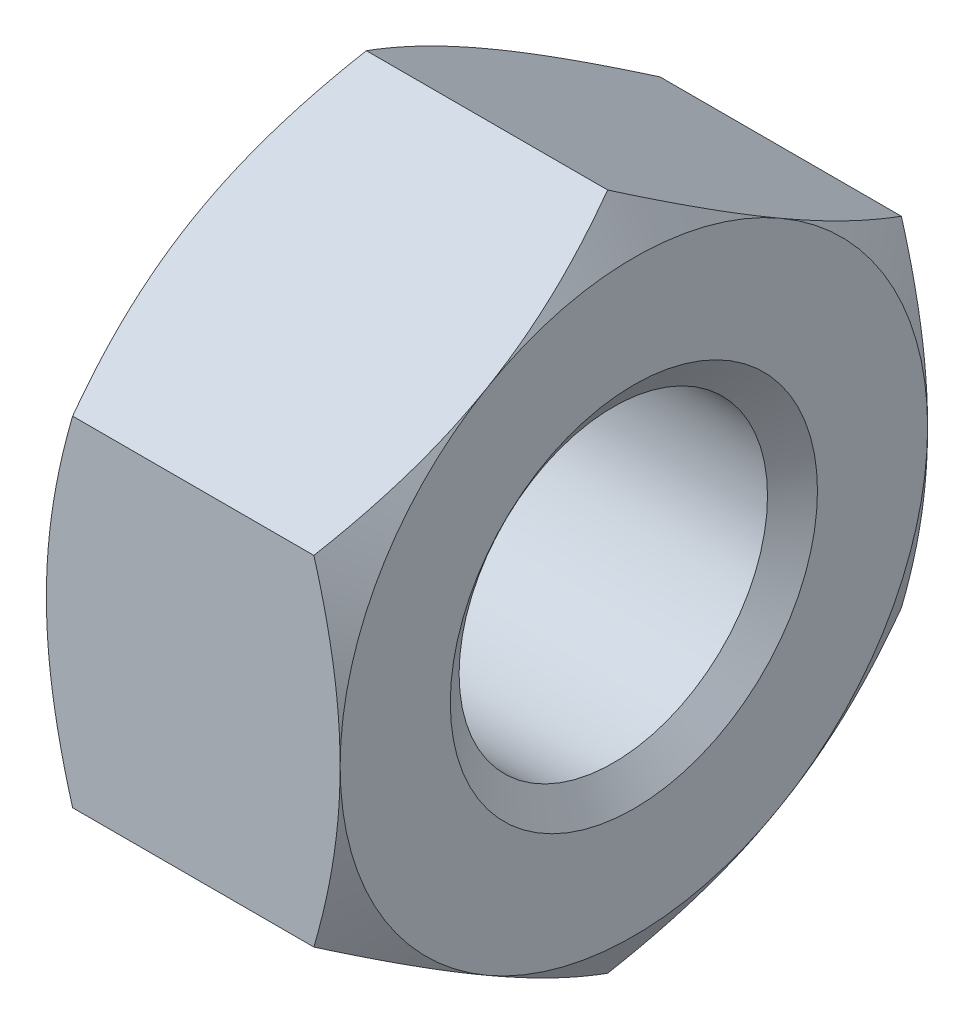
ISO-10303-21;
HEADER;
FILE_DESCRIPTION(('STEP AP214'),'2;1');
FILE_NAME('part.step','',(''),(''),'','','');
FILE_SCHEMA(('AUTOMOTIVE_DESIGN { 1 0 10303 214 1 1 1 1 }'));
ENDSEC;
DATA;
#1=APPLICATION_CONTEXT('core data for automotive mechanical design processes');
#2=APPLICATION_PROTOCOL_DEFINITION('international standard','automotive_design',2000,#1);
#3=PRODUCT_CONTEXT('',#1,'mechanical');
#4=PRODUCT('Part','Part','',(#3));
#5=PRODUCT_RELATED_PRODUCT_CATEGORY('part','',(#4));
#6=PRODUCT_DEFINITION_FORMATION('','',#4);
#7=PRODUCT_DEFINITION_CONTEXT('part definition',#1,'design');
#8=PRODUCT_DEFINITION('design','',#6,#7);
#9=PRODUCT_DEFINITION_SHAPE('','',#8);
#10=(LENGTH_UNIT() NAMED_UNIT(*) SI_UNIT(.MILLI.,.METRE.));
#11=(NAMED_UNIT(*) PLANE_ANGLE_UNIT() SI_UNIT($,.RADIAN.));
#12=(NAMED_UNIT(*) SI_UNIT($,.STERADIAN.) SOLID_ANGLE_UNIT());
#13=UNCERTAINTY_MEASURE_WITH_UNIT(LENGTH_MEASURE(1.E-05),#10,'distance_accuracy_value','');
#14=(GEOMETRIC_REPRESENTATION_CONTEXT(3) GLOBAL_UNCERTAINTY_ASSIGNED_CONTEXT((#13)) GLOBAL_UNIT_ASSIGNED_CONTEXT((#10,
#11,#12)) REPRESENTATION_CONTEXT('',''));
#15=CARTESIAN_POINT('',(0.,0.,0.));
#16=DIRECTION('',(0.,0.,1.));
#17=DIRECTION('',(1.,0.,0.));
#18=AXIS2_PLACEMENT_3D('',#15,#16,#17);
#19=CARTESIAN_POINT('',(-26.,14.9999999999999,0.));
#20=DIRECTION('',(1.,0.,0.));
#21=DIRECTION('',(0.,0.,-1.));
#22=AXIS2_PLACEMENT_3D('',#19,#20,#21);
#23=CYLINDRICAL_SURFACE('',#22,2.1);
#24=CARTESIAN_POINT('',(-22.2800830152839,14.9999999999999,0.));
#25=DIRECTION('',(1.,0.,0.));
#26=DIRECTION('',(0.,0.,-1.));
#27=AXIS2_PLACEMENT_3D('',#24,#25,#26);
#28=CIRCLE('',#27,2.1);
#29=CARTESIAN_POINT('',(-22.2800830152839,14.9999999999999,-2.1));
#30=VERTEX_POINT('',#29);
#31=EDGE_CURVE('E157',#30,#30,#28,.F.);
#32=ORIENTED_EDGE('',*,*,#31,.F.);
#33=EDGE_LOOP('',(#32));
#34=FACE_BOUND('',#33,.T.);
#35=CARTESIAN_POINT('',(-25.6945169847161,14.9999999999999,0.));
#36=DIRECTION('',(-1.,0.,0.));
#37=DIRECTION('',(0.,0.,1.));
#38=AXIS2_PLACEMENT_3D('',#35,#36,#37);
#39=CIRCLE('',#38,2.1);
#40=CARTESIAN_POINT('',(-25.6945169847161,14.9999999999999,2.1));
#41=VERTEX_POINT('',#40);
#42=EDGE_CURVE('E21',#41,#41,#39,.F.);
#43=ORIENTED_EDGE('',*,*,#42,.F.);
#44=EDGE_LOOP('',(#43));
#45=FACE_BOUND('',#44,.T.);
#46=ADVANCED_FACE('F16',(#34,#45),#23,.F.);
#47=CARTESIAN_POINT('',(-26.,14.9999999999999,7.99999999999999));
#48=DIRECTION('',(1.,0.,0.));
#49=DIRECTION('',(0.,0.,-1.));
#50=AXIS2_PLACEMENT_3D('',#47,#48,#49);
#51=PLANE('',#50);
#52=CARTESIAN_POINT('',(-26.,14.9999999999999,0.));
#53=DIRECTION('',(1.,0.,0.));
#54=DIRECTION('',(0.,0.,-1.));
#55=AXIS2_PLACEMENT_3D('',#52,#53,#54);
#56=CIRCLE('',#55,4.);
#57=CARTESIAN_POINT('',(-26.,14.9999999999999,-4.));
#58=VERTEX_POINT('',#57);
#59=CARTESIAN_POINT('',(-26.,18.4641016151377,-2.));
#60=VERTEX_POINT('',#59);
#61=EDGE_CURVE('E227',#58,#60,#56,.T.);
#62=ORIENTED_EDGE('',*,*,#61,.F.);
#63=CARTESIAN_POINT('',(-26.,14.9999999999999,0.));
#64=DIRECTION('',(1.,0.,0.));
#65=DIRECTION('',(0.,0.,-1.));
#66=AXIS2_PLACEMENT_3D('',#63,#64,#65);
#67=CIRCLE('',#66,4.);
#68=CARTESIAN_POINT('',(-26.,11.5358983848622,-2.));
#69=VERTEX_POINT('',#68);
#70=EDGE_CURVE('E151',#58,#69,#67,.F.);
#71=ORIENTED_EDGE('',*,*,#70,.T.);
#72=CARTESIAN_POINT('',(-26.,11.5358983848622,2.));
#73=VERTEX_POINT('',#72);
#74=EDGE_CURVE('E153',#69,#73,#67,.F.);
#75=ORIENTED_EDGE('',*,*,#74,.T.);
#76=CARTESIAN_POINT('',(-26.,14.9999999999999,4.));
#77=VERTEX_POINT('',#76);
#78=EDGE_CURVE('E385',#73,#77,#67,.F.);
#79=ORIENTED_EDGE('',*,*,#78,.T.);
#80=CARTESIAN_POINT('',(-26.,18.4641016151377,2.));
#81=VERTEX_POINT('',#80);
#82=EDGE_CURVE('E387',#77,#81,#67,.F.);
#83=ORIENTED_EDGE('',*,*,#82,.T.);
#84=EDGE_CURVE('E135',#81,#60,#67,.F.);
#85=ORIENTED_EDGE('',*,*,#84,.T.);
#86=EDGE_LOOP('',(#62,#71,#75,#79,#83,#85));
#87=FACE_BOUND('',#86,.T.);
#88=CARTESIAN_POINT('',(-26.,14.9999999999999,0.));
#89=DIRECTION('',(1.,0.,0.));
#90=DIRECTION('',(0.,0.,-1.));
#91=AXIS2_PLACEMENT_3D('',#88,#89,#90);
#92=CIRCLE('',#91,2.5);
#93=CARTESIAN_POINT('',(-26.,14.9999999999999,-2.5));
#94=VERTEX_POINT('',#93);
#95=EDGE_CURVE('E160',#94,#94,#92,.F.);
#96=ORIENTED_EDGE('',*,*,#95,.F.);
#97=EDGE_LOOP('',(#96));
#98=FACE_BOUND('',#97,.T.);
#99=ADVANCED_FACE('F280',(#87,#98),#51,.F.);
#100=CARTESIAN_POINT('',(-22.,14.9999999999999,7.99999999999999));
#101=DIRECTION('',(1.,0.,0.));
#102=DIRECTION('',(0.,0.,-1.));
#103=AXIS2_PLACEMENT_3D('',#100,#101,#102);
#104=PLANE('',#103);
#105=CARTESIAN_POINT('',(-22.,14.9999999999999,0.));
#106=DIRECTION('',(1.,0.,0.));
#107=DIRECTION('',(0.,0.,-1.));
#108=AXIS2_PLACEMENT_3D('',#105,#106,#107);
#109=CIRCLE('',#108,4.);
#110=CARTESIAN_POINT('',(-22.,11.5358983848622,-2.));
#111=VERTEX_POINT('',#110);
#112=CARTESIAN_POINT('',(-22.,14.9999999999999,-4.));
#113=VERTEX_POINT('',#112);
#114=EDGE_CURVE('E28',#111,#113,#109,.T.);
#115=ORIENTED_EDGE('',*,*,#114,.T.);
#116=CARTESIAN_POINT('',(-22.,14.9999999999999,0.));
#117=DIRECTION('',(1.,0.,0.));
#118=DIRECTION('',(0.,0.,-1.));
#119=AXIS2_PLACEMENT_3D('',#116,#117,#118);
#120=CIRCLE('',#119,4.);
#121=CARTESIAN_POINT('',(-22.,18.4641016151377,-2.));
#122=VERTEX_POINT('',#121);
#123=EDGE_CURVE('E35',#113,#122,#120,.T.);
#124=ORIENTED_EDGE('',*,*,#123,.T.);
#125=CARTESIAN_POINT('',(-22.,18.4641016151377,2.));
#126=VERTEX_POINT('',#125);
#127=EDGE_CURVE('E11',#122,#126,#109,.T.);
#128=ORIENTED_EDGE('',*,*,#127,.T.);
#129=CARTESIAN_POINT('',(-22.,14.9999999999999,4.));
#130=VERTEX_POINT('',#129);
#131=EDGE_CURVE('E26',#126,#130,#109,.T.);
#132=ORIENTED_EDGE('',*,*,#131,.T.);
#133=CARTESIAN_POINT('',(-22.,11.5358983848622,2.));
#134=VERTEX_POINT('',#133);
#135=EDGE_CURVE('E331',#130,#134,#109,.T.);
#136=ORIENTED_EDGE('',*,*,#135,.T.);
#137=EDGE_CURVE('E156',#134,#111,#109,.T.);
#138=ORIENTED_EDGE('',*,*,#137,.T.);
#139=EDGE_LOOP('',(#115,#124,#128,#132,#136,#138));
#140=FACE_BOUND('',#139,.T.);
#141=CARTESIAN_POINT('',(-22.,14.9999999999999,0.));
#142=DIRECTION('',(1.,0.,0.));
#143=DIRECTION('',(0.,0.,-1.));
#144=AXIS2_PLACEMENT_3D('',#141,#142,#143);
#145=CIRCLE('',#144,2.5);
#146=CARTESIAN_POINT('',(-22.,14.9999999999999,-2.5));
#147=VERTEX_POINT('',#146);
#148=EDGE_CURVE('E159',#147,#147,#145,.T.);
#149=ORIENTED_EDGE('',*,*,#148,.F.);
#150=EDGE_LOOP('',(#149));
#151=FACE_BOUND('',#150,.T.);
#152=ADVANCED_FACE('F232',(#140,#151),#104,.T.);
#153=CARTESIAN_POINT('',(-26.,19.6188021535169,0.));
#154=DIRECTION('',(0.,0.866025403784438,0.500000000000001));
#155=DIRECTION('',(0.,-0.500000000000001,0.866025403784438));
#156=AXIS2_PLACEMENT_3D('',#153,#154,#155);
#157=PLANE('',#156);
#158=DIRECTION('',(1.,0.,0.));
#159=VECTOR('',#158,1.);
#160=CARTESIAN_POINT('',(-26.,17.3094010767584,4.));
#161=LINE('',#160,#159);
#162=CARTESIAN_POINT('',(-25.6427344100918,17.3094010767584,4.));
#163=VERTEX_POINT('',#162);
#164=CARTESIAN_POINT('',(-22.3572655899082,17.3094010767584,4.));
#165=VERTEX_POINT('',#164);
#166=EDGE_CURVE('E147',#163,#165,#161,.T.);
#167=ORIENTED_EDGE('',*,*,#166,.T.);
#168=CARTESIAN_POINT('',(-22.3573322590748,17.3092856067046,4.0002));
#169=CARTESIAN_POINT('',(-22.2987178736483,17.4107717464616,3.82442084967677));
#170=CARTESIAN_POINT('',(-22.2454103214623,17.5131339088349,3.64712438367362));
#171=CARTESIAN_POINT('',(-22.1523616707464,17.719630724798,3.28946140682429));
#172=CARTESIAN_POINT('',(-22.1126534890297,17.823769047419,3.10908854102985));
#173=CARTESIAN_POINT('',(-22.0508422152803,18.0307551001179,2.75057818129721));
#174=CARTESIAN_POINT('',(-22.0283277315229,18.1335709837248,2.57249584706486));
#175=CARTESIAN_POINT('',(-22.0014506231466,18.3396865102852,2.21549328283349));
#176=CARTESIAN_POINT('',(-21.9970657414269,18.4429854041143,2.0365743503559));
#177=CARTESIAN_POINT('',(-22.00619007294,18.6360035252293,1.70225715780327));
#178=CARTESIAN_POINT('',(-22.017458953988,18.7257516533506,1.54680884001293));
#179=CARTESIAN_POINT('',(-22.0531739907982,18.9046632039205,1.23692494436494));
#180=CARTESIAN_POINT('',(-22.0776323457115,18.9938260075947,1.08249043825587));
#181=CARTESIAN_POINT('',(-22.1387760649193,19.1731064101519,0.771967672225419));
#182=CARTESIAN_POINT('',(-22.1757206036549,19.2632013193812,0.615918711936896));
#183=CARTESIAN_POINT('',(-22.259570072548,19.4420474282754,0.30614816459616));
#184=CARTESIAN_POINT('',(-22.3064553022127,19.5308009190496,0.152422609226222));
#185=CARTESIAN_POINT('',(-22.3573322590748,19.6189176235708,-0.00019999999999901));
#186=B_SPLINE_CURVE_WITH_KNOTS('',3,(#168,#169,#170,#171,#172,#173,#174,#175,#176,#177,#178,
#179,#180,#181,#182,#183,#184,#185),.UNSPECIFIED.,.F.,.F.,(4,2,2,2,2,2,2,2,4),(0.,
0.634047835695968,1.26961969224544,1.88946157213122,2.50854226669297,3.04757825393386,
3.58711366126904,4.13861653143764,4.68903648037743),.UNSPECIFIED.);
#187=EDGE_CURVE('E43',#165,#126,#186,.T.);
#188=ORIENTED_EDGE('',*,*,#187,.T.);
#189=CARTESIAN_POINT('',(-22.3572655899082,19.6188021535169,0.));
#190=VERTEX_POINT('',#189);
#191=EDGE_CURVE('E221',#126,#190,#186,.T.);
#192=ORIENTED_EDGE('',*,*,#191,.T.);
#193=DIRECTION('',(1.,0.,0.));
#194=VECTOR('',#193,1.);
#195=CARTESIAN_POINT('',(-26.,19.6188021535169,0.));
#196=LINE('',#195,#194);
#197=CARTESIAN_POINT('',(-25.6427344100918,19.6188021535169,0.));
#198=VERTEX_POINT('',#197);
#199=EDGE_CURVE('E132',#198,#190,#196,.T.);
#200=ORIENTED_EDGE('',*,*,#199,.F.);
#201=CARTESIAN_POINT('',(-25.6426677409252,17.3092856067046,4.0002));
#202=CARTESIAN_POINT('',(-25.7012821263517,17.4107717464616,3.82442084967677));
#203=CARTESIAN_POINT('',(-25.7545896785377,17.5131339088349,3.64712438367362));
#204=CARTESIAN_POINT('',(-25.8476383292536,17.719630724798,3.28946140682429));
#205=CARTESIAN_POINT('',(-25.8873465109703,17.823769047419,3.10908854102985));
#206=CARTESIAN_POINT('',(-25.9491577847197,18.0307551001179,2.75057818129721));
#207=CARTESIAN_POINT('',(-25.9716722684771,18.1335709837248,2.57249584706486));
#208=CARTESIAN_POINT('',(-25.9985493768534,18.3396865102852,2.21549328283349));
#209=CARTESIAN_POINT('',(-26.002934258573,18.4429854041143,2.0365743503559));
#210=CARTESIAN_POINT('',(-25.99380992706,18.6360035252293,1.70225715780327));
#211=CARTESIAN_POINT('',(-25.982541046012,18.7257516533506,1.54680884001293));
#212=CARTESIAN_POINT('',(-25.9468260092018,18.9046632039205,1.23692494436494));
#213=CARTESIAN_POINT('',(-25.9223676542885,18.9938260075947,1.08249043825587));
#214=CARTESIAN_POINT('',(-25.8612239350807,19.1731064101519,0.77196767222542));
#215=CARTESIAN_POINT('',(-25.8242793963451,19.2632013193812,0.615918711936897));
#216=CARTESIAN_POINT('',(-25.740429927452,19.4420474282754,0.306148164596161));
#217=CARTESIAN_POINT('',(-25.6935446977872,19.5308009190496,0.152422609226221));
#218=CARTESIAN_POINT('',(-25.6426677409252,19.6189176235708,-0.000199999999999123));
#219=B_SPLINE_CURVE_WITH_KNOTS('',3,(#201,#202,#203,#204,#205,#206,#207,#208,#209,#210,#211,
#212,#213,#214,#215,#216,#217,#218),.UNSPECIFIED.,.F.,.F.,(4,2,2,2,2,2,2,2,4),(0.,
0.63404783569597,1.26961969224544,1.88946157213122,2.50854226669297,3.04757825393386,
3.58711366126904,4.13861653143764,4.68903648037743),.UNSPECIFIED.);
#220=EDGE_CURVE('E150',#81,#198,#219,.T.);
#221=ORIENTED_EDGE('',*,*,#220,.F.);
#222=EDGE_CURVE('E242',#163,#81,#219,.T.);
#223=ORIENTED_EDGE('',*,*,#222,.F.);
#224=EDGE_LOOP('',(#167,#188,#192,#200,#221,#223));
#225=FACE_BOUND('',#224,.T.);
#226=ADVANCED_FACE('F18',(#225),#157,.T.);
#227=CARTESIAN_POINT('',(-26.,17.3094010767584,-4.));
#228=DIRECTION('',(0.,0.866025403784438,-0.5));
#229=DIRECTION('',(0.,0.5,0.866025403784439));
#230=AXIS2_PLACEMENT_3D('',#227,#228,#229);
#231=PLANE('',#230);
#232=ORIENTED_EDGE('',*,*,#199,.T.);
#233=CARTESIAN_POINT('',(-22.3573322590748,19.6189176235708,0.000200000000000769));
#234=CARTESIAN_POINT('',(-22.2987178736483,19.5174314838137,-0.175579150323228));
#235=CARTESIAN_POINT('',(-22.2454103214623,19.4150693214404,-0.352875616326382));
#236=CARTESIAN_POINT('',(-22.1523616707464,19.2085725054773,-0.710538593175708));
#237=CARTESIAN_POINT('',(-22.1126534890297,19.1044341828564,-0.890911458970152));
#238=CARTESIAN_POINT('',(-22.0508422152803,18.8974481301575,-1.24942181870279));
#239=CARTESIAN_POINT('',(-22.0283277315229,18.7946322465505,-1.42750415293514));
#240=CARTESIAN_POINT('',(-22.0014506231466,18.5885167199902,-1.78450671716651));
#241=CARTESIAN_POINT('',(-21.9970657414269,18.4852178261611,-1.9634256496441));
#242=CARTESIAN_POINT('',(-22.00619007294,18.2921997050461,-2.29774284219673));
#243=CARTESIAN_POINT('',(-22.017458953988,18.2024515769248,-2.45319115998707));
#244=CARTESIAN_POINT('',(-22.0531739907982,18.0235400263549,-2.76307505563506));
#245=CARTESIAN_POINT('',(-22.0776323457115,17.9343772226807,-2.91750956174413));
#246=CARTESIAN_POINT('',(-22.1387760649193,17.7550968201235,-3.22803232777458));
#247=CARTESIAN_POINT('',(-22.1757206036549,17.6650019108941,-3.3840812880631));
#248=CARTESIAN_POINT('',(-22.259570072548,17.4861558019999,-3.69385183540384));
#249=CARTESIAN_POINT('',(-22.3064553022127,17.3974023112258,-3.84757739077378));
#250=CARTESIAN_POINT('',(-22.3573322590748,17.3092856067046,-4.0002));
#251=B_SPLINE_CURVE_WITH_KNOTS('',3,(#233,#234,#235,#236,#237,#238,#239,#240,#241,#242,#243,
#244,#245,#246,#247,#248,#249,#250),.UNSPECIFIED.,.F.,.F.,(4,2,2,2,2,2,2,2,4),(0.,
0.63404783569597,1.26961969224544,1.88946157213122,2.50854226669297,3.04757825393386,
3.58711366126904,4.13861653143764,4.68903648037743),.UNSPECIFIED.);
#252=EDGE_CURVE('E125',#190,#122,#251,.T.);
#253=ORIENTED_EDGE('',*,*,#252,.T.);
#254=CARTESIAN_POINT('',(-22.3572655899082,17.3094010767584,-4.));
#255=VERTEX_POINT('',#254);
#256=EDGE_CURVE('E111',#122,#255,#251,.T.);
#257=ORIENTED_EDGE('',*,*,#256,.T.);
#258=DIRECTION('',(1.,0.,0.));
#259=VECTOR('',#258,1.);
#260=CARTESIAN_POINT('',(-26.,17.3094010767584,-4.));
#261=LINE('',#260,#259);
#262=CARTESIAN_POINT('',(-25.6427344100918,17.3094010767584,-4.));
#263=VERTEX_POINT('',#262);
#264=EDGE_CURVE('E124',#263,#255,#261,.T.);
#265=ORIENTED_EDGE('',*,*,#264,.F.);
#266=CARTESIAN_POINT('',(-25.6426677409252,19.6189176235708,0.000200000000000769));
#267=CARTESIAN_POINT('',(-25.7012821263517,19.5174314838137,-0.175579150323229));
#268=CARTESIAN_POINT('',(-25.7545896785377,19.4150693214404,-0.352875616326383));
#269=CARTESIAN_POINT('',(-25.8476383292536,19.2085725054773,-0.710538593175708));
#270=CARTESIAN_POINT('',(-25.8873465109703,19.1044341828564,-0.890911458970152));
#271=CARTESIAN_POINT('',(-25.9491577847197,18.8974481301575,-1.24942181870279));
#272=CARTESIAN_POINT('',(-25.9716722684771,18.7946322465505,-1.42750415293514));
#273=CARTESIAN_POINT('',(-25.9985493768534,18.5885167199902,-1.78450671716651));
#274=CARTESIAN_POINT('',(-26.002934258573,18.4852178261611,-1.9634256496441));
#275=CARTESIAN_POINT('',(-25.99380992706,18.2921997050461,-2.29774284219673));
#276=CARTESIAN_POINT('',(-25.982541046012,18.2024515769248,-2.45319115998707));
#277=CARTESIAN_POINT('',(-25.9468260092018,18.0235400263549,-2.76307505563506));
#278=CARTESIAN_POINT('',(-25.9223676542885,17.9343772226807,-2.91750956174413));
#279=CARTESIAN_POINT('',(-25.8612239350807,17.7550968201235,-3.22803232777458));
#280=CARTESIAN_POINT('',(-25.8242793963451,17.6650019108941,-3.3840812880631));
#281=CARTESIAN_POINT('',(-25.740429927452,17.4861558019999,-3.69385183540384));
#282=CARTESIAN_POINT('',(-25.6935446977873,17.3974023112258,-3.84757739077378));
#283=CARTESIAN_POINT('',(-25.6426677409252,17.3092856067046,-4.0002));
#284=B_SPLINE_CURVE_WITH_KNOTS('',3,(#266,#267,#268,#269,#270,#271,#272,#273,#274,#275,#276,
#277,#278,#279,#280,#281,#282,#283),.UNSPECIFIED.,.F.,.F.,(4,2,2,2,2,2,2,2,4),(0.,
0.63404783569597,1.26961969224544,1.88946157213122,2.50854226669297,3.04757825393386,
3.58711366126904,4.13861653143764,4.68903648037743),.UNSPECIFIED.);
#285=EDGE_CURVE('E236',#60,#263,#284,.T.);
#286=ORIENTED_EDGE('',*,*,#285,.F.);
#287=EDGE_CURVE('E241',#198,#60,#284,.T.);
#288=ORIENTED_EDGE('',*,*,#287,.F.);
#289=EDGE_LOOP('',(#232,#253,#257,#265,#286,#288));
#290=FACE_BOUND('',#289,.T.);
#291=ADVANCED_FACE('F122',(#290),#231,.T.);
#292=CARTESIAN_POINT('',(-26.,17.3094010767584,-4.));
#293=DIRECTION('',(0.,0.,1.));
#294=DIRECTION('',(1.,0.,0.));
#295=AXIS2_PLACEMENT_3D('',#292,#293,#294);
#296=PLANE('',#295);
#297=CARTESIAN_POINT('',(-23.9141068212406,8.87512801004101,-4.));
#298=CARTESIAN_POINT('',(-23.8292362707669,9.05075062961317,-4.));
#299=CARTESIAN_POINT('',(-23.7452094038074,9.22678847904707,-4.));
#300=CARTESIAN_POINT('',(-23.5793251467972,9.57991915222038,-4.));
#301=CARTESIAN_POINT('',(-23.4974681323672,9.75701215220065,-4.));
#302=CARTESIAN_POINT('',(-23.3359744630585,10.1134342831366,-4.));
#303=CARTESIAN_POINT('',(-23.256353195063,10.2927704111063,-4.));
#304=CARTESIAN_POINT('',(-23.1005305854203,10.6529166525273,-4.));
#305=CARTESIAN_POINT('',(-23.024329065508,10.8337266885646,-4.));
#306=CARTESIAN_POINT('',(-22.8753506503944,11.1993529325502,-4.));
#307=CARTESIAN_POINT('',(-22.8026272842158,11.3841910717722,-4.));
#308=CARTESIAN_POINT('',(-22.6628762309594,11.7560475320502,-4.));
#309=CARTESIAN_POINT('',(-22.5958491775665,11.9430660930419,-4.));
#310=CARTESIAN_POINT('',(-22.4692917484309,12.3191968174622,-4.));
#311=CARTESIAN_POINT('',(-22.4097454347838,12.5083035628714,-4.));
#312=CARTESIAN_POINT('',(-22.3000833565445,12.8892054536414,-4.));
#313=CARTESIAN_POINT('',(-22.2499646096767,13.0809997281424,-4.));
#314=CARTESIAN_POINT('',(-22.161590794954,13.4674076730179,-4.));
#315=CARTESIAN_POINT('',(-22.1233388859565,13.6620220796834,-4.));
#316=CARTESIAN_POINT('',(-22.0612742359223,14.0535972741274,-4.));
#317=CARTESIAN_POINT('',(-22.0374615076517,14.2505580639802,-4.));
#318=CARTESIAN_POINT('',(-22.0063818131494,14.644548010372,-4.));
#319=CARTESIAN_POINT('',(-21.9990100992389,14.8415686889059,-4.));
#320=CARTESIAN_POINT('',(-22.0012040663748,15.2354720856074,-4.));
#321=CARTESIAN_POINT('',(-22.0107653508153,15.4323548263121,-4.));
#322=CARTESIAN_POINT('',(-22.0408787346136,15.7685606352254,-4.));
#323=CARTESIAN_POINT('',(-22.0575092960439,15.9082546183817,-4.));
#324=CARTESIAN_POINT('',(-22.0982134103467,16.1865634906349,-4.));
#325=CARTESIAN_POINT('',(-22.1222881370584,16.3251782060101,-4.));
#326=CARTESIAN_POINT('',(-22.2044150709502,16.7392904545296,-4.));
#327=CARTESIAN_POINT('',(-22.2723488864251,17.0128469052871,-4.));
#328=CARTESIAN_POINT('',(-22.3895163593172,17.4221825301452,-4.));
#329=CARTESIAN_POINT('',(-22.4317139418116,17.5600953636153,-4.));
#330=CARTESIAN_POINT('',(-22.5202845802278,17.834481591014,-4.));
#331=CARTESIAN_POINT('',(-22.5666547561869,17.9709559062355,-4.));
#332=CARTESIAN_POINT('',(-22.6626056991803,18.2418944051633,-4.));
#333=CARTESIAN_POINT('',(-22.7121669257535,18.3763655794683,-4.));
#334=CARTESIAN_POINT('',(-22.8141983537907,18.6442646115291,-4.));
#335=CARTESIAN_POINT('',(-22.8666697309634,18.7776920223938,-4.));
#336=CARTESIAN_POINT('',(-22.9203090065418,18.9106369898668,-4.));
#337=B_SPLINE_CURVE_WITH_KNOTS('',3,(#297,#298,#299,#300,#301,#302,#303,#304,#305,#306,#307,
#308,#309,#310,#311,#312,#313,#314,#315,#316,#317,#318,#319,#320,#321,#322,#323,#324,#325,#326,
#327,#328,#329,#330,#331,#332,#333,#334,#335,#336),.UNSPECIFIED.,.F.,.F.,(4,2,2,2,2,2,2,2,2,2,2,
2,2,2,2,2,2,2,2,4),(0.,0.585171792532268,1.17044423059927,1.75906594645989,2.34765694284826,
2.94347400997483,3.53935727210689,4.133948646976,4.72835161391471,5.32291267067845,
5.91747425310813,6.50823685854037,7.09884609659886,7.52068140825521,7.94258327130839,
8.78701491359829,9.21965281897688,9.65199437116297,10.0819024146297,10.5119854255247),.UNSPECIFIED.);
#338=CARTESIAN_POINT('',(-22.3572655899082,12.6905989232414,-4.));
#339=VERTEX_POINT('',#338);
#340=EDGE_CURVE('E117',#339,#113,#337,.T.);
#341=ORIENTED_EDGE('',*,*,#340,.F.);
#342=DIRECTION('',(1.,0.,0.));
#343=VECTOR('',#342,1.);
#344=CARTESIAN_POINT('',(-26.,12.6905989232414,-4.));
#345=LINE('',#344,#343);
#346=CARTESIAN_POINT('',(-25.6427344100918,12.6905989232414,-4.));
#347=VERTEX_POINT('',#346);
#348=EDGE_CURVE('E133',#347,#339,#345,.T.);
#349=ORIENTED_EDGE('',*,*,#348,.F.);
#350=CARTESIAN_POINT('',(-24.0858931787593,8.87512801004101,-4.));
#351=CARTESIAN_POINT('',(-24.1707637292331,9.05075062961317,-4.));
#352=CARTESIAN_POINT('',(-24.2547905961926,9.22678847904707,-4.));
#353=CARTESIAN_POINT('',(-24.4206748532028,9.57991915222038,-4.));
#354=CARTESIAN_POINT('',(-24.5025318676328,9.75701215220065,-4.));
#355=CARTESIAN_POINT('',(-24.6640255369414,10.1134342831366,-4.));
#356=CARTESIAN_POINT('',(-24.743646804937,10.2927704111063,-4.));
#357=CARTESIAN_POINT('',(-24.8994694145797,10.6529166525273,-4.));
#358=CARTESIAN_POINT('',(-24.975670934492,10.8337266885646,-4.));
#359=CARTESIAN_POINT('',(-25.1246493496056,11.1993529325502,-4.));
#360=CARTESIAN_POINT('',(-25.1973727157841,11.3841910717722,-4.));
#361=CARTESIAN_POINT('',(-25.3371237690406,11.7560475320502,-4.));
#362=CARTESIAN_POINT('',(-25.4041508224335,11.9430660930419,-4.));
#363=CARTESIAN_POINT('',(-25.5307082515691,12.3191968174622,-4.));
#364=CARTESIAN_POINT('',(-25.5902545652162,12.5083035628714,-4.));
#365=CARTESIAN_POINT('',(-25.6999166434555,12.8892054536414,-4.));
#366=CARTESIAN_POINT('',(-25.7500353903232,13.0809997281424,-4.));
#367=CARTESIAN_POINT('',(-25.8384092050459,13.4674076730179,-4.));
#368=CARTESIAN_POINT('',(-25.8766611140435,13.6620220796834,-4.));
#369=CARTESIAN_POINT('',(-25.9387257640777,14.0535972741274,-4.));
#370=CARTESIAN_POINT('',(-25.9625384923483,14.2505580639802,-4.));
#371=CARTESIAN_POINT('',(-25.9936181868506,14.644548010372,-4.));
#372=CARTESIAN_POINT('',(-26.000989900761,14.8415686889059,-4.));
#373=CARTESIAN_POINT('',(-25.9987959336252,15.2354720856074,-4.));
#374=CARTESIAN_POINT('',(-25.9892346491846,15.4323548263121,-4.));
#375=CARTESIAN_POINT('',(-25.9591212653864,15.7685606352254,-4.));
#376=CARTESIAN_POINT('',(-25.9424907039561,15.9082546183817,-4.));
#377=CARTESIAN_POINT('',(-25.9017865896533,16.1865634906349,-4.));
#378=CARTESIAN_POINT('',(-25.8777118629415,16.3251782060101,-4.));
#379=CARTESIAN_POINT('',(-25.7955849290498,16.7392904545296,-4.));
#380=CARTESIAN_POINT('',(-25.7276511135748,17.0128469052872,-4.));
#381=CARTESIAN_POINT('',(-25.6104836406828,17.4221825301452,-4.));
#382=CARTESIAN_POINT('',(-25.5682860581884,17.5600953636153,-4.));
#383=CARTESIAN_POINT('',(-25.4797154197722,17.834481591014,-4.));
#384=CARTESIAN_POINT('',(-25.4333452438131,17.9709559062355,-4.));
#385=CARTESIAN_POINT('',(-25.3373943008197,18.2418944051633,-4.));
#386=CARTESIAN_POINT('',(-25.2878330742465,18.3763655794683,-4.));
#387=CARTESIAN_POINT('',(-25.1858016462093,18.6442646115291,-4.));
#388=CARTESIAN_POINT('',(-25.1333302690366,18.7776920223938,-4.));
#389=CARTESIAN_POINT('',(-25.0796909934582,18.9106369898668,-4.));
#390=B_SPLINE_CURVE_WITH_KNOTS('',3,(#350,#351,#352,#353,#354,#355,#356,#357,#358,#359,#360,
#361,#362,#363,#364,#365,#366,#367,#368,#369,#370,#371,#372,#373,#374,#375,#376,#377,#378,#379,
#380,#381,#382,#383,#384,#385,#386,#387,#388,#389),.UNSPECIFIED.,.F.,.F.,(4,2,2,2,2,2,2,2,2,2,2,
2,2,2,2,2,2,2,2,4),(0.,0.585171792532273,1.17044423059927,1.7590659464599,2.34765694284827,
2.94347400997484,3.53935727210689,4.13394864697601,4.72835161391471,5.32291267067846,
5.91747425310813,6.50823685854037,7.09884609659886,7.52068140825521,7.9425832713084,
8.7870149135983,9.21965281897689,9.65199437116298,10.0819024146297,10.5119854255247),.UNSPECIFIED.);
#391=EDGE_CURVE('E247',#347,#58,#390,.T.);
#392=ORIENTED_EDGE('',*,*,#391,.T.);
#393=EDGE_CURVE('E131',#58,#263,#390,.T.);
#394=ORIENTED_EDGE('',*,*,#393,.T.);
#395=ORIENTED_EDGE('',*,*,#264,.T.);
#396=EDGE_CURVE('E108',#113,#255,#337,.T.);
#397=ORIENTED_EDGE('',*,*,#396,.F.);
#398=EDGE_LOOP('',(#341,#349,#392,#394,#395,#397));
#399=FACE_BOUND('',#398,.T.);
#400=ADVANCED_FACE('F128',(#399),#296,.F.);
#401=CARTESIAN_POINT('',(-26.,10.3811978464829,0.));
#402=DIRECTION('',(0.,-0.866025403784438,-0.500000000000001));
#403=DIRECTION('',(0.,0.500000000000001,-0.866025403784438));
#404=AXIS2_PLACEMENT_3D('',#401,#402,#403);
#405=PLANE('',#404);
#406=ORIENTED_EDGE('',*,*,#348,.T.);
#407=CARTESIAN_POINT('',(-22.3573322590748,12.6907143932953,-4.0002));
#408=CARTESIAN_POINT('',(-22.2987178736483,12.5892282535382,-3.82442084967677));
#409=CARTESIAN_POINT('',(-22.2454103214623,12.4868660911649,-3.64712438367362));
#410=CARTESIAN_POINT('',(-22.1523616707464,12.2803692752018,-3.28946140682429));
#411=CARTESIAN_POINT('',(-22.1126534890297,12.1762309525809,-3.10908854102985));
#412=CARTESIAN_POINT('',(-22.0508422152803,11.969244899882,-2.75057818129721));
#413=CARTESIAN_POINT('',(-22.0283277315229,11.866429016275,-2.57249584706486));
#414=CARTESIAN_POINT('',(-22.0014506231466,11.6603134897146,-2.21549328283349));
#415=CARTESIAN_POINT('',(-21.9970657414269,11.5570145958856,-2.0365743503559));
#416=CARTESIAN_POINT('',(-22.00619007294,11.3639964747706,-1.70225715780327));
#417=CARTESIAN_POINT('',(-22.017458953988,11.2742483466493,-1.54680884001293));
#418=CARTESIAN_POINT('',(-22.0531739907982,11.0953367960794,-1.23692494436494));
#419=CARTESIAN_POINT('',(-22.0776323457115,11.0061739924051,-1.08249043825587));
#420=CARTESIAN_POINT('',(-22.1387760649193,10.826893589848,-0.771967672225422));
#421=CARTESIAN_POINT('',(-22.1757206036549,10.7367986806186,-0.615918711936898));
#422=CARTESIAN_POINT('',(-22.259570072548,10.5579525717244,-0.306148164596161));
#423=CARTESIAN_POINT('',(-22.3064553022127,10.4691990809503,-0.152422609226221));
#424=CARTESIAN_POINT('',(-22.3573322590748,10.3810823764291,0.000199999999999972));
#425=B_SPLINE_CURVE_WITH_KNOTS('',3,(#407,#408,#409,#410,#411,#412,#413,#414,#415,#416,#417,
#418,#419,#420,#421,#422,#423,#424),.UNSPECIFIED.,.F.,.F.,(4,2,2,2,2,2,2,2,4),(0.,
0.634047835695967,1.26961969224544,1.88946157213122,2.50854226669298,3.04757825393386,
3.58711366126904,4.13861653143764,4.68903648037744),.UNSPECIFIED.);
#426=EDGE_CURVE('E319',#339,#111,#425,.T.);
#427=ORIENTED_EDGE('',*,*,#426,.T.);
#428=CARTESIAN_POINT('',(-22.3572655899082,10.3811978464829,0.));
#429=VERTEX_POINT('',#428);
#430=EDGE_CURVE('E208',#111,#429,#425,.T.);
#431=ORIENTED_EDGE('',*,*,#430,.T.);
#432=DIRECTION('',(1.,0.,0.));
#433=VECTOR('',#432,1.);
#434=CARTESIAN_POINT('',(-26.,10.3811978464829,0.));
#435=LINE('',#434,#433);
#436=CARTESIAN_POINT('',(-25.6427344100918,10.3811978464829,0.));
#437=VERTEX_POINT('',#436);
#438=EDGE_CURVE('E138',#437,#429,#435,.T.);
#439=ORIENTED_EDGE('',*,*,#438,.F.);
#440=CARTESIAN_POINT('',(-25.6426677409252,12.6907143932953,-4.0002));
#441=CARTESIAN_POINT('',(-25.7012821263517,12.5892282535382,-3.82442084967677));
#442=CARTESIAN_POINT('',(-25.7545896785377,12.4868660911649,-3.64712438367362));
#443=CARTESIAN_POINT('',(-25.8476383292536,12.2803692752018,-3.28946140682429));
#444=CARTESIAN_POINT('',(-25.8873465109703,12.1762309525809,-3.10908854102985));
#445=CARTESIAN_POINT('',(-25.9491577847197,11.969244899882,-2.75057818129721));
#446=CARTESIAN_POINT('',(-25.9716722684771,11.866429016275,-2.57249584706486));
#447=CARTESIAN_POINT('',(-25.9985493768534,11.6603134897146,-2.21549328283349));
#448=CARTESIAN_POINT('',(-26.002934258573,11.5570145958856,-2.0365743503559));
#449=CARTESIAN_POINT('',(-25.99380992706,11.3639964747706,-1.70225715780327));
#450=CARTESIAN_POINT('',(-25.982541046012,11.2742483466493,-1.54680884001293));
#451=CARTESIAN_POINT('',(-25.9468260092018,11.0953367960794,-1.23692494436494));
#452=CARTESIAN_POINT('',(-25.9223676542885,11.0061739924051,-1.08249043825587));
#453=CARTESIAN_POINT('',(-25.8612239350807,10.826893589848,-0.771967672225421));
#454=CARTESIAN_POINT('',(-25.8242793963451,10.7367986806186,-0.615918711936897));
#455=CARTESIAN_POINT('',(-25.740429927452,10.5579525717244,-0.30614816459616));
#456=CARTESIAN_POINT('',(-25.6935446977872,10.4691990809503,-0.152422609226221));
#457=CARTESIAN_POINT('',(-25.6426677409252,10.3810823764291,0.000199999999999971));
#458=B_SPLINE_CURVE_WITH_KNOTS('',3,(#440,#441,#442,#443,#444,#445,#446,#447,#448,#449,#450,
#451,#452,#453,#454,#455,#456,#457),.UNSPECIFIED.,.F.,.F.,(4,2,2,2,2,2,2,2,4),(0.,
0.634047835695967,1.26961969224543,1.88946157213122,2.50854226669297,3.04757825393386,
3.58711366126904,4.13861653143764,4.68903648037744),.UNSPECIFIED.);
#459=EDGE_CURVE('E253',#69,#437,#458,.T.);
#460=ORIENTED_EDGE('',*,*,#459,.F.);
#461=EDGE_CURVE('E252',#347,#69,#458,.T.);
#462=ORIENTED_EDGE('',*,*,#461,.F.);
#463=EDGE_LOOP('',(#406,#427,#431,#439,#460,#462));
#464=FACE_BOUND('',#463,.T.);
#465=ADVANCED_FACE('F263',(#464),#405,.T.);
#466=CARTESIAN_POINT('',(-26.,12.6905989232414,4.));
#467=DIRECTION('',(0.,-0.866025403784438,0.500000000000001));
#468=DIRECTION('',(0.,-0.500000000000001,-0.866025403784438));
#469=AXIS2_PLACEMENT_3D('',#466,#467,#468);
#470=PLANE('',#469);
#471=ORIENTED_EDGE('',*,*,#438,.T.);
#472=CARTESIAN_POINT('',(-22.3573322590748,10.3810823764291,-0.000200000000000376));
#473=CARTESIAN_POINT('',(-22.2987178736483,10.4825685161861,0.175579150323228));
#474=CARTESIAN_POINT('',(-22.2454103214623,10.5849306785594,0.352875616326382));
#475=CARTESIAN_POINT('',(-22.1523616707464,10.7914274945225,0.710538593175708));
#476=CARTESIAN_POINT('',(-22.1126534890297,10.8955658171435,0.890911458970153));
#477=CARTESIAN_POINT('',(-22.0508422152803,11.1025518698424,1.24942181870279));
#478=CARTESIAN_POINT('',(-22.0283277315229,11.2053677534493,1.42750415293515));
#479=CARTESIAN_POINT('',(-22.0014506231466,11.4114832800097,1.78450671716651));
#480=CARTESIAN_POINT('',(-21.9970657414269,11.5147821738388,1.9634256496441));
#481=CARTESIAN_POINT('',(-22.00619007294,11.7078002949537,2.29774284219674));
#482=CARTESIAN_POINT('',(-22.017458953988,11.7975484230751,2.45319115998707));
#483=CARTESIAN_POINT('',(-22.0531739907982,11.976459973645,2.76307505563506));
#484=CARTESIAN_POINT('',(-22.0776323457115,12.0656227773192,2.91750956174413));
#485=CARTESIAN_POINT('',(-22.1387760649193,12.2449031798764,3.22803232777458));
#486=CARTESIAN_POINT('',(-22.1757206036549,12.3349980891057,3.3840812880631));
#487=CARTESIAN_POINT('',(-22.259570072548,12.5138441979999,3.69385183540384));
#488=CARTESIAN_POINT('',(-22.3064553022127,12.6025976887741,3.84757739077378));
#489=CARTESIAN_POINT('',(-22.3573322590748,12.6907143932953,4.0002));
#490=B_SPLINE_CURVE_WITH_KNOTS('',3,(#472,#473,#474,#475,#476,#477,#478,#479,#480,#481,#482,
#483,#484,#485,#486,#487,#488,#489),.UNSPECIFIED.,.F.,.F.,(4,2,2,2,2,2,2,2,4),(0.,
0.634047835695969,1.26961969224544,1.88946157213123,2.50854226669298,3.04757825393386,
3.58711366126904,4.13861653143764,4.68903648037744),.UNSPECIFIED.);
#491=EDGE_CURVE('E322',#429,#134,#490,.T.);
#492=ORIENTED_EDGE('',*,*,#491,.T.);
#493=CARTESIAN_POINT('',(-22.3572655899082,12.6905989232414,4.));
#494=VERTEX_POINT('',#493);
#495=EDGE_CURVE('E181',#134,#494,#490,.T.);
#496=ORIENTED_EDGE('',*,*,#495,.T.);
#497=DIRECTION('',(1.,0.,0.));
#498=VECTOR('',#497,1.);
#499=CARTESIAN_POINT('',(-26.,12.6905989232414,4.));
#500=LINE('',#499,#498);
#501=CARTESIAN_POINT('',(-25.6427344100918,12.6905989232414,4.));
#502=VERTEX_POINT('',#501);
#503=EDGE_CURVE('E144',#502,#494,#500,.T.);
#504=ORIENTED_EDGE('',*,*,#503,.F.);
#505=CARTESIAN_POINT('',(-25.6426677409252,10.3810823764291,-0.000200000000000376));
#506=CARTESIAN_POINT('',(-25.7012821263517,10.4825685161861,0.175579150323228));
#507=CARTESIAN_POINT('',(-25.7545896785377,10.5849306785594,0.352875616326382));
#508=CARTESIAN_POINT('',(-25.8476383292536,10.7914274945225,0.710538593175708));
#509=CARTESIAN_POINT('',(-25.8873465109703,10.8955658171435,0.890911458970153));
#510=CARTESIAN_POINT('',(-25.9491577847197,11.1025518698424,1.24942181870279));
#511=CARTESIAN_POINT('',(-25.9716722684771,11.2053677534493,1.42750415293515));
#512=CARTESIAN_POINT('',(-25.9985493768534,11.4114832800097,1.78450671716651));
#513=CARTESIAN_POINT('',(-26.002934258573,11.5147821738388,1.9634256496441));
#514=CARTESIAN_POINT('',(-25.99380992706,11.7078002949537,2.29774284219674));
#515=CARTESIAN_POINT('',(-25.982541046012,11.7975484230751,2.45319115998707));
#516=CARTESIAN_POINT('',(-25.9468260092018,11.976459973645,2.76307505563506));
#517=CARTESIAN_POINT('',(-25.9223676542885,12.0656227773192,2.91750956174413));
#518=CARTESIAN_POINT('',(-25.8612239350807,12.2449031798764,3.22803232777458));
#519=CARTESIAN_POINT('',(-25.8242793963451,12.3349980891057,3.3840812880631));
#520=CARTESIAN_POINT('',(-25.740429927452,12.5138441979999,3.69385183540384));
#521=CARTESIAN_POINT('',(-25.6935446977872,12.6025976887741,3.84757739077378));
#522=CARTESIAN_POINT('',(-25.6426677409252,12.6907143932953,4.0002));
#523=B_SPLINE_CURVE_WITH_KNOTS('',3,(#505,#506,#507,#508,#509,#510,#511,#512,#513,#514,#515,
#516,#517,#518,#519,#520,#521,#522),.UNSPECIFIED.,.F.,.F.,(4,2,2,2,2,2,2,2,4),(0.,
0.634047835695969,1.26961969224544,1.88946157213123,2.50854226669298,3.04757825393386,
3.58711366126904,4.13861653143764,4.68903648037743),.UNSPECIFIED.);
#524=EDGE_CURVE('E259',#73,#502,#523,.T.);
#525=ORIENTED_EDGE('',*,*,#524,.F.);
#526=EDGE_CURVE('E258',#437,#73,#523,.T.);
#527=ORIENTED_EDGE('',*,*,#526,.F.);
#528=EDGE_LOOP('',(#471,#492,#496,#504,#525,#527));
#529=FACE_BOUND('',#528,.T.);
#530=ADVANCED_FACE('F266',(#529),#470,.T.);
#531=CARTESIAN_POINT('',(-26.,17.3094010767584,4.));
#532=DIRECTION('',(0.,0.,1.));
#533=DIRECTION('',(1.,0.,0.));
#534=AXIS2_PLACEMENT_3D('',#531,#532,#533);
#535=PLANE('',#534);
#536=ORIENTED_EDGE('',*,*,#503,.T.);
#537=CARTESIAN_POINT('',(-23.9141068212406,8.87512801004101,4.));
#538=CARTESIAN_POINT('',(-23.8292362707669,9.05075062961317,4.));
#539=CARTESIAN_POINT('',(-23.7452094038074,9.22678847904707,4.));
#540=CARTESIAN_POINT('',(-23.5793251467972,9.57991915222038,4.));
#541=CARTESIAN_POINT('',(-23.4974681323672,9.75701215220065,4.));
#542=CARTESIAN_POINT('',(-23.3359744630585,10.1134342831366,4.));
#543=CARTESIAN_POINT('',(-23.256353195063,10.2927704111063,4.));
#544=CARTESIAN_POINT('',(-23.1005305854203,10.6529166525273,4.));
#545=CARTESIAN_POINT('',(-23.024329065508,10.8337266885646,4.));
#546=CARTESIAN_POINT('',(-22.8753506503944,11.1993529325502,4.));
#547=CARTESIAN_POINT('',(-22.8026272842158,11.3841910717722,4.));
#548=CARTESIAN_POINT('',(-22.6628762309594,11.7560475320502,4.));
#549=CARTESIAN_POINT('',(-22.5958491775665,11.9430660930419,4.));
#550=CARTESIAN_POINT('',(-22.4692917484309,12.3191968174622,4.));
#551=CARTESIAN_POINT('',(-22.4097454347838,12.5083035628714,4.));
#552=CARTESIAN_POINT('',(-22.3000833565445,12.8892054536414,4.));
#553=CARTESIAN_POINT('',(-22.2499646096767,13.0809997281424,4.));
#554=CARTESIAN_POINT('',(-22.161590794954,13.4674076730179,4.));
#555=CARTESIAN_POINT('',(-22.1233388859565,13.6620220796834,4.));
#556=CARTESIAN_POINT('',(-22.0612742359223,14.0535972741274,4.));
#557=CARTESIAN_POINT('',(-22.0374615076517,14.2505580639802,4.));
#558=CARTESIAN_POINT('',(-22.0063818131494,14.644548010372,4.));
#559=CARTESIAN_POINT('',(-21.9990100992389,14.8415686889059,4.));
#560=CARTESIAN_POINT('',(-22.0012040663748,15.2354720856074,4.));
#561=CARTESIAN_POINT('',(-22.0107653508153,15.4323548263121,4.));
#562=CARTESIAN_POINT('',(-22.0408787346136,15.7685606352254,4.));
#563=CARTESIAN_POINT('',(-22.0575092960439,15.9082546183817,4.));
#564=CARTESIAN_POINT('',(-22.0982134103467,16.1865634906349,4.));
#565=CARTESIAN_POINT('',(-22.1222881370584,16.3251782060101,4.));
#566=CARTESIAN_POINT('',(-22.2044150709502,16.7392904545296,4.));
#567=CARTESIAN_POINT('',(-22.2723488864251,17.0128469052871,4.));
#568=CARTESIAN_POINT('',(-22.3895163593172,17.4221825301452,4.));
#569=CARTESIAN_POINT('',(-22.4317139418116,17.5600953636153,4.));
#570=CARTESIAN_POINT('',(-22.5202845802278,17.834481591014,4.));
#571=CARTESIAN_POINT('',(-22.5666547561869,17.9709559062355,4.));
#572=CARTESIAN_POINT('',(-22.6626056991803,18.2418944051633,4.));
#573=CARTESIAN_POINT('',(-22.7121669257535,18.3763655794683,4.));
#574=CARTESIAN_POINT('',(-22.8141983537907,18.6442646115291,4.));
#575=CARTESIAN_POINT('',(-22.8666697309634,18.7776920223938,4.));
#576=CARTESIAN_POINT('',(-22.9203090065418,18.9106369898668,4.));
#577=B_SPLINE_CURVE_WITH_KNOTS('',3,(#537,#538,#539,#540,#541,#542,#543,#544,#545,#546,#547,
#548,#549,#550,#551,#552,#553,#554,#555,#556,#557,#558,#559,#560,#561,#562,#563,#564,#565,#566,
#567,#568,#569,#570,#571,#572,#573,#574,#575,#576),.UNSPECIFIED.,.F.,.F.,(4,2,2,2,2,2,2,2,2,2,2,
2,2,2,2,2,2,2,2,4),(0.,0.585171792532269,1.17044423059927,1.75906594645989,2.34765694284827,
2.94347400997483,3.53935727210689,4.13394864697601,4.72835161391471,5.32291267067845,
5.91747425310813,6.50823685854037,7.09884609659886,7.52068140825521,7.94258327130839,
8.78701491359829,9.21965281897688,9.65199437116297,10.0819024146297,10.5119854255247),.UNSPECIFIED.);
#578=EDGE_CURVE('E180',#494,#130,#577,.T.);
#579=ORIENTED_EDGE('',*,*,#578,.T.);
#580=EDGE_CURVE('E174',#130,#165,#577,.T.);
#581=ORIENTED_EDGE('',*,*,#580,.T.);
#582=ORIENTED_EDGE('',*,*,#166,.F.);
#583=CARTESIAN_POINT('',(-24.0858931787593,8.87512801004101,4.));
#584=CARTESIAN_POINT('',(-24.1707637292331,9.05075062961317,4.));
#585=CARTESIAN_POINT('',(-24.2547905961926,9.22678847904707,4.));
#586=CARTESIAN_POINT('',(-24.4206748532028,9.57991915222038,4.));
#587=CARTESIAN_POINT('',(-24.5025318676328,9.75701215220065,4.));
#588=CARTESIAN_POINT('',(-24.6640255369414,10.1134342831366,4.));
#589=CARTESIAN_POINT('',(-24.743646804937,10.2927704111063,4.));
#590=CARTESIAN_POINT('',(-24.8994694145797,10.6529166525273,4.));
#591=CARTESIAN_POINT('',(-24.975670934492,10.8337266885646,4.));
#592=CARTESIAN_POINT('',(-25.1246493496056,11.1993529325502,4.));
#593=CARTESIAN_POINT('',(-25.1973727157841,11.3841910717722,4.));
#594=CARTESIAN_POINT('',(-25.3371237690406,11.7560475320502,4.));
#595=CARTESIAN_POINT('',(-25.4041508224335,11.9430660930419,4.));
#596=CARTESIAN_POINT('',(-25.5307082515691,12.3191968174622,4.));
#597=CARTESIAN_POINT('',(-25.5902545652162,12.5083035628714,4.));
#598=CARTESIAN_POINT('',(-25.6999166434555,12.8892054536414,4.));
#599=CARTESIAN_POINT('',(-25.7500353903232,13.0809997281424,4.));
#600=CARTESIAN_POINT('',(-25.8384092050459,13.4674076730179,4.));
#601=CARTESIAN_POINT('',(-25.8766611140435,13.6620220796834,4.));
#602=CARTESIAN_POINT('',(-25.9387257640777,14.0535972741274,4.));
#603=CARTESIAN_POINT('',(-25.9625384923483,14.2505580639802,4.));
#604=CARTESIAN_POINT('',(-25.9936181868506,14.644548010372,4.));
#605=CARTESIAN_POINT('',(-26.000989900761,14.8415686889059,4.));
#606=CARTESIAN_POINT('',(-25.9987959336252,15.2354720856074,4.));
#607=CARTESIAN_POINT('',(-25.9892346491846,15.4323548263121,4.));
#608=CARTESIAN_POINT('',(-25.9591212653864,15.7685606352254,4.));
#609=CARTESIAN_POINT('',(-25.9424907039561,15.9082546183817,4.));
#610=CARTESIAN_POINT('',(-25.9017865896533,16.1865634906349,4.));
#611=CARTESIAN_POINT('',(-25.8777118629415,16.3251782060101,4.));
#612=CARTESIAN_POINT('',(-25.7955849290498,16.7392904545296,4.));
#613=CARTESIAN_POINT('',(-25.7276511135748,17.0128469052871,4.));
#614=CARTESIAN_POINT('',(-25.6104836406828,17.4221825301452,4.));
#615=CARTESIAN_POINT('',(-25.5682860581884,17.5600953636153,4.));
#616=CARTESIAN_POINT('',(-25.4797154197722,17.834481591014,4.));
#617=CARTESIAN_POINT('',(-25.4333452438131,17.9709559062355,4.));
#618=CARTESIAN_POINT('',(-25.3373943008197,18.2418944051633,4.));
#619=CARTESIAN_POINT('',(-25.2878330742465,18.3763655794683,4.));
#620=CARTESIAN_POINT('',(-25.1858016462093,18.6442646115291,4.));
#621=CARTESIAN_POINT('',(-25.1333302690366,18.7776920223938,4.));
#622=CARTESIAN_POINT('',(-25.0796909934582,18.9106369898668,4.));
#623=B_SPLINE_CURVE_WITH_KNOTS('',3,(#583,#584,#585,#586,#587,#588,#589,#590,#591,#592,#593,
#594,#595,#596,#597,#598,#599,#600,#601,#602,#603,#604,#605,#606,#607,#608,#609,#610,#611,#612,
#613,#614,#615,#616,#617,#618,#619,#620,#621,#622),.UNSPECIFIED.,.F.,.F.,(4,2,2,2,2,2,2,2,2,2,2,
2,2,2,2,2,2,2,2,4),(0.,0.585171792532269,1.17044423059927,1.75906594645989,2.34765694284826,
2.94347400997483,3.53935727210689,4.133948646976,4.72835161391471,5.32291267067845,
5.91747425310813,6.50823685854037,7.09884609659886,7.52068140825521,7.94258327130839,
8.78701491359829,9.21965281897688,9.65199437116297,10.0819024146297,10.5119854255247),.UNSPECIFIED.);
#624=EDGE_CURVE('E370',#77,#163,#623,.T.);
#625=ORIENTED_EDGE('',*,*,#624,.F.);
#626=EDGE_CURVE('E371',#502,#77,#623,.T.);
#627=ORIENTED_EDGE('',*,*,#626,.F.);
#628=EDGE_LOOP('',(#536,#579,#581,#582,#625,#627));
#629=FACE_BOUND('',#628,.T.);
#630=ADVANCED_FACE('F187',(#629),#535,.T.);
#631=CARTESIAN_POINT('',(-26.,14.9999999999999,0.));
#632=DIRECTION('',(1.,0.,0.));
#633=DIRECTION('',(0.,0.,-1.));
#634=AXIS2_PLACEMENT_3D('',#631,#632,#633);
#635=CONICAL_SURFACE('',#634,4.,1.0471975511966);
#636=ORIENTED_EDGE('',*,*,#285,.T.);
#637=ORIENTED_EDGE('',*,*,#393,.F.);
#638=ORIENTED_EDGE('',*,*,#61,.T.);
#639=EDGE_LOOP('',(#636,#637,#638));
#640=FACE_BOUND('',#639,.T.);
#641=ADVANCED_FACE('F277',(#640),#635,.T.);
#642=ORIENTED_EDGE('',*,*,#220,.T.);
#643=ORIENTED_EDGE('',*,*,#287,.T.);
#644=ORIENTED_EDGE('',*,*,#84,.F.);
#645=EDGE_LOOP('',(#642,#643,#644));
#646=FACE_BOUND('',#645,.T.);
#647=ADVANCED_FACE('F353',(#646),#635,.T.);
#648=ORIENTED_EDGE('',*,*,#222,.T.);
#649=ORIENTED_EDGE('',*,*,#82,.F.);
#650=ORIENTED_EDGE('',*,*,#624,.T.);
#651=EDGE_LOOP('',(#648,#649,#650));
#652=FACE_BOUND('',#651,.T.);
#653=ADVANCED_FACE('F347',(#652),#635,.T.);
#654=ORIENTED_EDGE('',*,*,#524,.T.);
#655=ORIENTED_EDGE('',*,*,#626,.T.);
#656=ORIENTED_EDGE('',*,*,#78,.F.);
#657=EDGE_LOOP('',(#654,#655,#656));
#658=FACE_BOUND('',#657,.T.);
#659=ADVANCED_FACE('F200',(#658),#635,.T.);
#660=ORIENTED_EDGE('',*,*,#459,.T.);
#661=ORIENTED_EDGE('',*,*,#526,.T.);
#662=ORIENTED_EDGE('',*,*,#74,.F.);
#663=EDGE_LOOP('',(#660,#661,#662));
#664=FACE_BOUND('',#663,.T.);
#665=ADVANCED_FACE('F345',(#664),#635,.T.);
#666=ORIENTED_EDGE('',*,*,#461,.T.);
#667=ORIENTED_EDGE('',*,*,#70,.F.);
#668=ORIENTED_EDGE('',*,*,#391,.F.);
#669=EDGE_LOOP('',(#666,#667,#668));
#670=FACE_BOUND('',#669,.T.);
#671=ADVANCED_FACE('F341',(#670),#635,.T.);
#672=CARTESIAN_POINT('',(-22.,14.9999999999999,0.));
#673=DIRECTION('',(-1.,0.,0.));
#674=DIRECTION('',(0.,0.,1.));
#675=AXIS2_PLACEMENT_3D('',#672,#673,#674);
#676=CONICAL_SURFACE('',#675,4.,1.0471975511966);
#677=ORIENTED_EDGE('',*,*,#340,.T.);
#678=ORIENTED_EDGE('',*,*,#114,.F.);
#679=ORIENTED_EDGE('',*,*,#426,.F.);
#680=EDGE_LOOP('',(#677,#678,#679));
#681=FACE_BOUND('',#680,.T.);
#682=ADVANCED_FACE('F303',(#681),#676,.T.);
#683=ORIENTED_EDGE('',*,*,#137,.F.);
#684=ORIENTED_EDGE('',*,*,#491,.F.);
#685=ORIENTED_EDGE('',*,*,#430,.F.);
#686=EDGE_LOOP('',(#683,#684,#685));
#687=FACE_BOUND('',#686,.T.);
#688=ADVANCED_FACE('F195',(#687),#676,.T.);
#689=ORIENTED_EDGE('',*,*,#135,.F.);
#690=ORIENTED_EDGE('',*,*,#578,.F.);
#691=ORIENTED_EDGE('',*,*,#495,.F.);
#692=EDGE_LOOP('',(#689,#690,#691));
#693=FACE_BOUND('',#692,.T.);
#694=ADVANCED_FACE('F189',(#693),#676,.T.);
#695=ORIENTED_EDGE('',*,*,#580,.F.);
#696=ORIENTED_EDGE('',*,*,#131,.F.);
#697=ORIENTED_EDGE('',*,*,#187,.F.);
#698=EDGE_LOOP('',(#695,#696,#697));
#699=FACE_BOUND('',#698,.T.);
#700=ADVANCED_FACE('F194',(#699),#676,.T.);
#701=ORIENTED_EDGE('',*,*,#127,.F.);
#702=ORIENTED_EDGE('',*,*,#252,.F.);
#703=ORIENTED_EDGE('',*,*,#191,.F.);
#704=EDGE_LOOP('',(#701,#702,#703));
#705=FACE_BOUND('',#704,.T.);
#706=ADVANCED_FACE('F197',(#705),#676,.T.);
#707=ORIENTED_EDGE('',*,*,#123,.F.);
#708=ORIENTED_EDGE('',*,*,#396,.T.);
#709=ORIENTED_EDGE('',*,*,#256,.F.);
#710=EDGE_LOOP('',(#707,#708,#709));
#711=FACE_BOUND('',#710,.T.);
#712=ADVANCED_FACE('F110',(#711),#676,.T.);
#713=CARTESIAN_POINT('',(-22.3080913168123,14.9999999999999,0.));
#714=DIRECTION('',(1.,0.,0.));
#715=DIRECTION('',(0.,0.,-1.));
#716=AXIS2_PLACEMENT_3D('',#713,#714,#715);
#717=CONICAL_SURFACE('',#716,2.06,0.959931088596884);
#718=ORIENTED_EDGE('',*,*,#148,.T.);
#719=EDGE_LOOP('',(#718));
#720=FACE_BOUND('',#719,.T.);
#721=ORIENTED_EDGE('',*,*,#31,.T.);
#722=EDGE_LOOP('',(#721));
#723=FACE_BOUND('',#722,.T.);
#724=ADVANCED_FACE('F198',(#720,#723),#717,.F.);
#725=CARTESIAN_POINT('',(-25.9746,14.9999999999999,0.));
#726=DIRECTION('',(-1.,0.,0.));
#727=DIRECTION('',(0.,0.,1.));
#728=AXIS2_PLACEMENT_3D('',#725,#726,#727);
#729=CONICAL_SURFACE('',#728,2.5,0.959931088596883);
#730=CARTESIAN_POINT('',(-25.9746,14.9999999999999,0.));
#731=DIRECTION('',(1.,0.,0.));
#732=DIRECTION('',(0.,0.,-1.));
#733=AXIS2_PLACEMENT_3D('',#730,#731,#732);
#734=CIRCLE('',#733,2.5);
#735=CARTESIAN_POINT('',(-25.9746,14.9999999999999,-2.5));
#736=VERTEX_POINT('',#735);
#737=EDGE_CURVE('E162',#736,#736,#734,.T.);
#738=ORIENTED_EDGE('',*,*,#737,.F.);
#739=EDGE_LOOP('',(#738));
#740=FACE_BOUND('',#739,.T.);
#741=ORIENTED_EDGE('',*,*,#42,.T.);
#742=EDGE_LOOP('',(#741));
#743=FACE_BOUND('',#742,.T.);
#744=ADVANCED_FACE('F290',(#740,#743),#729,.F.);
#745=CARTESIAN_POINT('',(-47.0375057290932,14.9999999999999,0.));
#746=DIRECTION('',(1.,0.,0.));
#747=DIRECTION('',(0.,0.,-1.));
#748=AXIS2_PLACEMENT_3D('',#745,#746,#747);
#749=CYLINDRICAL_SURFACE('',#748,2.5);
#750=ORIENTED_EDGE('',*,*,#737,.T.);
#751=EDGE_LOOP('',(#750));
#752=FACE_BOUND('',#751,.T.);
#753=ORIENTED_EDGE('',*,*,#95,.T.);
#754=EDGE_LOOP('',(#753));
#755=FACE_BOUND('',#754,.T.);
#756=ADVANCED_FACE('F292',(#752,#755),#749,.F.);
#757=CLOSED_SHELL('',(#46,#99,#152,#226,#291,#400,#465,#530,#630,#641,#647,#653,#659,#665,#671,
#682,#688,#694,#700,#706,#712,#724,#744,#756));
#758=MANIFOLD_SOLID_BREP('B1',#757);
#759=ADVANCED_BREP_SHAPE_REPRESENTATION('',(#18,#758),#14);
#760=SHAPE_DEFINITION_REPRESENTATION(#9,#759);
ENDSEC;
END-ISO-10303-21;
